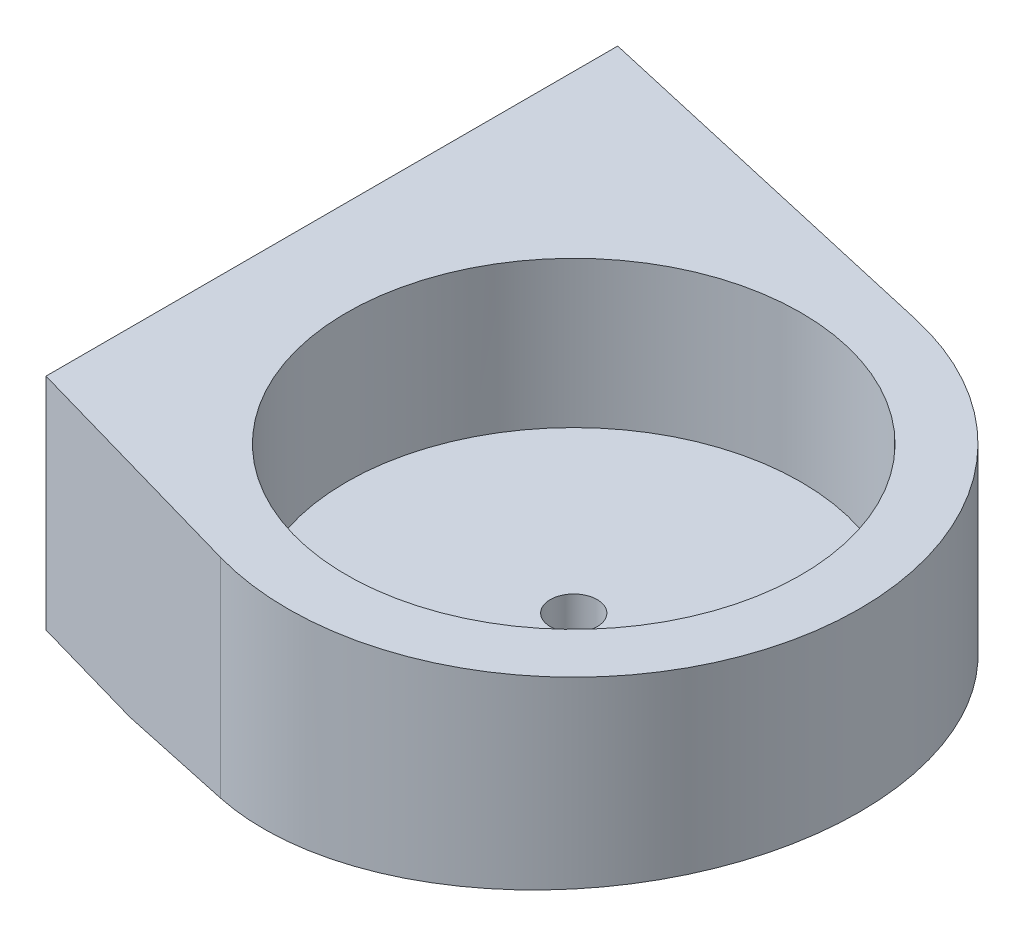
ISO-10303-21;
HEADER;
FILE_DESCRIPTION(('STEP AP214'),'2;1');
FILE_NAME('part.step','',(''),(''),'','','');
FILE_SCHEMA(('AUTOMOTIVE_DESIGN { 1 0 10303 214 1 1 1 1 }'));
ENDSEC;
DATA;
#1=APPLICATION_CONTEXT('core data for automotive mechanical design processes');
#2=APPLICATION_PROTOCOL_DEFINITION('international standard','automotive_design',2000,#1);
#3=PRODUCT_CONTEXT('',#1,'mechanical');
#4=PRODUCT('Part','Part','',(#3));
#5=PRODUCT_RELATED_PRODUCT_CATEGORY('part','',(#4));
#6=PRODUCT_DEFINITION_FORMATION('','',#4);
#7=PRODUCT_DEFINITION_CONTEXT('part definition',#1,'design');
#8=PRODUCT_DEFINITION('design','',#6,#7);
#9=PRODUCT_DEFINITION_SHAPE('','',#8);
#10=(LENGTH_UNIT() NAMED_UNIT(*) SI_UNIT(.MILLI.,.METRE.));
#11=(NAMED_UNIT(*) PLANE_ANGLE_UNIT() SI_UNIT($,.RADIAN.));
#12=(NAMED_UNIT(*) SI_UNIT($,.STERADIAN.) SOLID_ANGLE_UNIT());
#13=UNCERTAINTY_MEASURE_WITH_UNIT(LENGTH_MEASURE(1.E-05),#10,'distance_accuracy_value','');
#14=(GEOMETRIC_REPRESENTATION_CONTEXT(3) GLOBAL_UNCERTAINTY_ASSIGNED_CONTEXT((#13)) GLOBAL_UNIT_ASSIGNED_CONTEXT((#10,
#11,#12)) REPRESENTATION_CONTEXT('',''));
#15=CARTESIAN_POINT('',(0.,0.,0.));
#16=DIRECTION('',(0.,0.,1.));
#17=DIRECTION('',(1.,0.,0.));
#18=AXIS2_PLACEMENT_3D('',#15,#16,#17);
#19=CARTESIAN_POINT('',(4.32348319389158,15.,-19.0146652106246));
#20=DIRECTION('',(0.221717086866235,0.,-0.975111036442287));
#21=DIRECTION('',(-0.975111036442287,0.,-0.221717086866235));
#22=AXIS2_PLACEMENT_3D('',#19,#20,#21);
#23=PLANE('',#22);
#24=DIRECTION('',(0.,-1.,0.));
#25=VECTOR('',#24,1.);
#26=CARTESIAN_POINT('',(4.32348319389158,15.,-19.0146652106246));
#27=LINE('',#26,#25);
#28=CARTESIAN_POINT('',(4.32348319389158,15.,-19.0146652106246));
#29=VERTEX_POINT('',#28);
#30=CARTESIAN_POINT('',(4.32348319389158,1.64090894273656,-19.0146652106246));
#31=VERTEX_POINT('',#30);
#32=EDGE_CURVE('E81',#29,#31,#27,.T.);
#33=ORIENTED_EDGE('',*,*,#32,.T.);
#34=DIRECTION('',(-0.971414372160437,-0.086992331835263,-0.220876553219231));
#35=VECTOR('',#34,1.);
#36=CARTESIAN_POINT('',(5.4524012180103,1.7420060792248,-18.7579760682972));
#37=LINE('',#36,#35);
#38=CARTESIAN_POINT('',(-14.,0.,-23.1809900322722));
#39=VERTEX_POINT('',#38);
#40=EDGE_CURVE('E92',#31,#39,#37,.T.);
#41=ORIENTED_EDGE('',*,*,#40,.T.);
#42=DIRECTION('',(0.975111036442287,0.,0.221717086866235));
#43=VECTOR('',#42,1.);
#44=CARTESIAN_POINT('',(4.32348319389158,0.,-19.0146652106246));
#45=LINE('',#44,#43);
#46=CARTESIAN_POINT('',(-22.,0.,-25.));
#47=VERTEX_POINT('',#46);
#48=EDGE_CURVE('E96',#47,#39,#45,.T.);
#49=ORIENTED_EDGE('',*,*,#48,.F.);
#50=DIRECTION('',(0.,-1.,0.));
#51=VECTOR('',#50,1.);
#52=CARTESIAN_POINT('',(-22.,15.,-25.));
#53=LINE('',#52,#51);
#54=CARTESIAN_POINT('',(-22.,15.,-25.));
#55=VERTEX_POINT('',#54);
#56=EDGE_CURVE('E60',#55,#47,#53,.T.);
#57=ORIENTED_EDGE('',*,*,#56,.F.);
#58=DIRECTION('',(0.975111036442287,0.,0.221717086866235));
#59=VECTOR('',#58,1.);
#60=CARTESIAN_POINT('',(4.32348319389158,15.,-19.0146652106246));
#61=LINE('',#60,#59);
#62=EDGE_CURVE('E130',#55,#29,#61,.T.);
#63=ORIENTED_EDGE('',*,*,#62,.T.);
#64=EDGE_LOOP('',(#33,#41,#49,#57,#63));
#65=FACE_BOUND('',#64,.T.);
#66=ADVANCED_FACE('F37',(#65),#23,.T.);
#67=CARTESIAN_POINT('',(-5.3514292849436,15.,18.7513254093744));
#68=DIRECTION('',(-0.274432271022749,0.,0.961606431249966));
#69=DIRECTION('',(0.961606431249966,0.,0.274432271022749));
#70=AXIS2_PLACEMENT_3D('',#67,#68,#69);
#71=PLANE('',#70);
#72=DIRECTION('',(-0.961606431249966,0.,-0.274432271022749));
#73=VECTOR('',#72,1.);
#74=CARTESIAN_POINT('',(-5.3514292849436,0.,18.7513254093744));
#75=LINE('',#74,#73);
#76=CARTESIAN_POINT('',(-14.,0.,16.2831151049273));
#77=VERTEX_POINT('',#76);
#78=CARTESIAN_POINT('',(-22.,0.,14.));
#79=VERTEX_POINT('',#78);
#80=EDGE_CURVE('E100',#77,#79,#75,.T.);
#81=ORIENTED_EDGE('',*,*,#80,.F.);
#82=DIRECTION('',(0.958060684401584,0.0857964792001418,0.273420352499275));
#83=VECTOR('',#82,1.);
#84=CARTESIAN_POINT('',(-4.18211822024306,0.879213293709578,19.0850343786464));
#85=LINE('',#84,#83);
#86=CARTESIAN_POINT('',(-5.3514292849436,0.774498870005053,18.7513254093744));
#87=VERTEX_POINT('',#86);
#88=EDGE_CURVE('E51',#77,#87,#85,.T.);
#89=ORIENTED_EDGE('',*,*,#88,.T.);
#90=DIRECTION('',(0.,-1.,0.));
#91=VECTOR('',#90,1.);
#92=CARTESIAN_POINT('',(-5.3514292849436,15.,18.7513254093744));
#93=LINE('',#92,#91);
#94=CARTESIAN_POINT('',(-5.3514292849436,15.,18.7513254093744));
#95=VERTEX_POINT('',#94);
#96=EDGE_CURVE('E113',#95,#87,#93,.T.);
#97=ORIENTED_EDGE('',*,*,#96,.F.);
#98=DIRECTION('',(-0.961606431249966,0.,-0.274432271022749));
#99=VECTOR('',#98,1.);
#100=CARTESIAN_POINT('',(-5.3514292849436,15.,18.7513254093744));
#101=LINE('',#100,#99);
#102=CARTESIAN_POINT('',(-22.,15.,14.));
#103=VERTEX_POINT('',#102);
#104=EDGE_CURVE('E136',#95,#103,#101,.T.);
#105=ORIENTED_EDGE('',*,*,#104,.T.);
#106=DIRECTION('',(0.,-1.,0.));
#107=VECTOR('',#106,1.);
#108=CARTESIAN_POINT('',(-22.,15.,14.));
#109=LINE('',#108,#107);
#110=EDGE_CURVE('E110',#103,#79,#109,.T.);
#111=ORIENTED_EDGE('',*,*,#110,.T.);
#112=EDGE_LOOP('',(#81,#89,#97,#105,#111));
#113=FACE_BOUND('',#112,.T.);
#114=ADVANCED_FACE('F144',(#113),#71,.T.);
#115=CARTESIAN_POINT('',(0.,15.,0.));
#116=DIRECTION('',(0.,-1.,0.));
#117=DIRECTION('',(0.,0.,-1.));
#118=AXIS2_PLACEMENT_3D('',#115,#116,#117);
#119=CYLINDRICAL_SURFACE('',#118,19.5);
#120=ORIENTED_EDGE('',*,*,#96,.T.);
#121=CARTESIAN_POINT('',(0.,1.25373134328358,0.));
#122=DIRECTION('',(0.0891952975496599,-0.996014155971203,0.));
#123=DIRECTION('',(-0.996014155971203,-0.0891952975496599,0.));
#124=AXIS2_PLACEMENT_3D('',#121,#122,#123);
#125=ELLIPSE('',#124,19.5780349938759,19.5);
#126=EDGE_CURVE('E143',#87,#31,#125,.F.);
#127=ORIENTED_EDGE('',*,*,#126,.T.);
#128=ORIENTED_EDGE('',*,*,#32,.F.);
#129=CARTESIAN_POINT('',(0.,15.,0.));
#130=DIRECTION('',(0.,-1.,0.));
#131=DIRECTION('',(0.,0.,-1.));
#132=AXIS2_PLACEMENT_3D('',#129,#130,#131);
#133=CIRCLE('',#132,19.5);
#134=EDGE_CURVE('E132',#29,#95,#133,.T.);
#135=ORIENTED_EDGE('',*,*,#134,.T.);
#136=EDGE_LOOP('',(#120,#127,#128,#135));
#137=FACE_BOUND('',#136,.T.);
#138=ADVANCED_FACE('F142',(#137),#119,.T.);
#139=CARTESIAN_POINT('',(0.,0.,0.));
#140=DIRECTION('',(0.,1.,0.));
#141=DIRECTION('',(0.,0.,1.));
#142=AXIS2_PLACEMENT_3D('',#139,#140,#141);
#143=PLANE('',#142);
#144=CARTESIAN_POINT('',(-18.,0.,-5.5));
#145=DIRECTION('',(0.,-1.,0.));
#146=DIRECTION('',(0.,0.,-1.));
#147=AXIS2_PLACEMENT_3D('',#144,#145,#146);
#148=CIRCLE('',#147,2.05);
#149=CARTESIAN_POINT('',(-18.,0.,-7.55));
#150=VERTEX_POINT('',#149);
#151=EDGE_CURVE('E151',#150,#150,#148,.T.);
#152=ORIENTED_EDGE('',*,*,#151,.F.);
#153=EDGE_LOOP('',(#152));
#154=FACE_BOUND('',#153,.T.);
#155=DIRECTION('',(0.,0.,-1.));
#156=VECTOR('',#155,1.);
#157=CARTESIAN_POINT('',(-14.,0.,0.));
#158=LINE('',#157,#156);
#159=EDGE_CURVE('E11',#77,#39,#158,.T.);
#160=ORIENTED_EDGE('',*,*,#159,.F.);
#161=ORIENTED_EDGE('',*,*,#80,.T.);
#162=DIRECTION('',(0.,0.,-1.));
#163=VECTOR('',#162,1.);
#164=CARTESIAN_POINT('',(-22.,0.,0.));
#165=LINE('',#164,#163);
#166=EDGE_CURVE('E99',#79,#47,#165,.T.);
#167=ORIENTED_EDGE('',*,*,#166,.T.);
#168=ORIENTED_EDGE('',*,*,#48,.T.);
#169=EDGE_LOOP('',(#160,#161,#167,#168));
#170=FACE_BOUND('',#169,.T.);
#171=ADVANCED_FACE('F39',(#154,#170),#143,.F.);
#172=CARTESIAN_POINT('',(0.,5.,0.));
#173=DIRECTION('',(0.,1.,0.));
#174=DIRECTION('',(0.,0.,1.));
#175=AXIS2_PLACEMENT_3D('',#172,#173,#174);
#176=PLANE('',#175);
#177=CARTESIAN_POINT('',(0.,5.,0.));
#178=DIRECTION('',(0.,1.,0.));
#179=DIRECTION('',(0.,0.,1.));
#180=AXIS2_PLACEMENT_3D('',#177,#178,#179);
#181=CIRCLE('',#180,1.6);
#182=CARTESIAN_POINT('',(0.,5.,1.6));
#183=VERTEX_POINT('',#182);
#184=EDGE_CURVE('E145',#183,#183,#181,.T.);
#185=ORIENTED_EDGE('',*,*,#184,.F.);
#186=EDGE_LOOP('',(#185));
#187=FACE_BOUND('',#186,.T.);
#188=CARTESIAN_POINT('',(0.,5.,0.));
#189=DIRECTION('',(0.,1.,0.));
#190=DIRECTION('',(0.,0.,1.));
#191=AXIS2_PLACEMENT_3D('',#188,#189,#190);
#192=CIRCLE('',#191,15.5);
#193=CARTESIAN_POINT('',(0.,5.,15.5));
#194=VERTEX_POINT('',#193);
#195=EDGE_CURVE('E45',#194,#194,#192,.T.);
#196=ORIENTED_EDGE('',*,*,#195,.T.);
#197=EDGE_LOOP('',(#196));
#198=FACE_BOUND('',#197,.T.);
#199=ADVANCED_FACE('F119',(#187,#198),#176,.T.);
#200=CARTESIAN_POINT('',(-22.,15.,0.));
#201=DIRECTION('',(-1.,0.,0.));
#202=DIRECTION('',(0.,0.,1.));
#203=AXIS2_PLACEMENT_3D('',#200,#201,#202);
#204=PLANE('',#203);
#205=ORIENTED_EDGE('',*,*,#166,.F.);
#206=ORIENTED_EDGE('',*,*,#110,.F.);
#207=DIRECTION('',(0.,0.,-1.));
#208=VECTOR('',#207,1.);
#209=CARTESIAN_POINT('',(-22.,15.,0.));
#210=LINE('',#209,#208);
#211=EDGE_CURVE('E104',#103,#55,#210,.T.);
#212=ORIENTED_EDGE('',*,*,#211,.T.);
#213=ORIENTED_EDGE('',*,*,#56,.T.);
#214=EDGE_LOOP('',(#205,#206,#212,#213));
#215=FACE_BOUND('',#214,.T.);
#216=ADVANCED_FACE('F125',(#215),#204,.T.);
#217=CARTESIAN_POINT('',(0.,15.,0.));
#218=DIRECTION('',(0.,-1.,0.));
#219=DIRECTION('',(0.,0.,-1.));
#220=AXIS2_PLACEMENT_3D('',#217,#218,#219);
#221=CYLINDRICAL_SURFACE('',#220,15.5);
#222=ORIENTED_EDGE('',*,*,#195,.F.);
#223=EDGE_LOOP('',(#222));
#224=FACE_BOUND('',#223,.T.);
#225=CARTESIAN_POINT('',(0.,15.,0.));
#226=DIRECTION('',(0.,-1.,0.));
#227=DIRECTION('',(0.,0.,-1.));
#228=AXIS2_PLACEMENT_3D('',#225,#226,#227);
#229=CIRCLE('',#228,15.5);
#230=CARTESIAN_POINT('',(0.,15.,-15.5));
#231=VERTEX_POINT('',#230);
#232=EDGE_CURVE('E108',#231,#231,#229,.T.);
#233=ORIENTED_EDGE('',*,*,#232,.F.);
#234=EDGE_LOOP('',(#233));
#235=FACE_BOUND('',#234,.T.);
#236=ADVANCED_FACE('F121',(#224,#235),#221,.F.);
#237=CARTESIAN_POINT('',(0.,15.,0.));
#238=DIRECTION('',(0.,-1.,0.));
#239=DIRECTION('',(0.,0.,-1.));
#240=AXIS2_PLACEMENT_3D('',#237,#238,#239);
#241=PLANE('',#240);
#242=ORIENTED_EDGE('',*,*,#232,.T.);
#243=EDGE_LOOP('',(#242));
#244=FACE_BOUND('',#243,.T.);
#245=ORIENTED_EDGE('',*,*,#62,.F.);
#246=ORIENTED_EDGE('',*,*,#211,.F.);
#247=ORIENTED_EDGE('',*,*,#104,.F.);
#248=ORIENTED_EDGE('',*,*,#134,.F.);
#249=EDGE_LOOP('',(#245,#246,#247,#248));
#250=FACE_BOUND('',#249,.T.);
#251=ADVANCED_FACE('F124',(#244,#250),#241,.F.);
#252=CARTESIAN_POINT('',(-0.111381215469613,1.24375690607735,-24.));
#253=DIRECTION('',(0.0891952975496599,-0.996014155971203,0.));
#254=DIRECTION('',(0.996014155971203,0.0891952975496599,0.));
#255=AXIS2_PLACEMENT_3D('',#252,#253,#254);
#256=PLANE('',#255);
#257=CARTESIAN_POINT('',(0.,1.25373134328358,0.));
#258=DIRECTION('',(0.0891952975496599,-0.996014155971203,0.));
#259=DIRECTION('',(0.996014155971203,0.0891952975496599,0.));
#260=AXIS2_PLACEMENT_3D('',#257,#258,#259);
#261=ELLIPSE('',#260,4.01600717823096,4.);
#262=CARTESIAN_POINT('',(4.,1.61194029850746,0.));
#263=VERTEX_POINT('',#262);
#264=EDGE_CURVE('E157',#263,#263,#261,.F.);
#265=ORIENTED_EDGE('',*,*,#264,.T.);
#266=EDGE_LOOP('',(#265));
#267=FACE_BOUND('',#266,.T.);
#268=ORIENTED_EDGE('',*,*,#126,.F.);
#269=ORIENTED_EDGE('',*,*,#88,.F.);
#270=ORIENTED_EDGE('',*,*,#159,.T.);
#271=ORIENTED_EDGE('',*,*,#40,.F.);
#272=EDGE_LOOP('',(#268,#269,#270,#271));
#273=FACE_BOUND('',#272,.T.);
#274=ADVANCED_FACE('F91',(#267,#273),#256,.T.);
#275=CARTESIAN_POINT('',(0.,0.,0.));
#276=DIRECTION('',(0.,1.,0.));
#277=DIRECTION('',(0.,0.,1.));
#278=AXIS2_PLACEMENT_3D('',#275,#276,#277);
#279=CYLINDRICAL_SURFACE('',#278,1.6);
#280=CARTESIAN_POINT('',(0.,2.,0.));
#281=DIRECTION('',(0.,1.,0.));
#282=DIRECTION('',(0.,0.,1.));
#283=AXIS2_PLACEMENT_3D('',#280,#281,#282);
#284=CIRCLE('',#283,1.6);
#285=CARTESIAN_POINT('',(0.,2.,1.6));
#286=VERTEX_POINT('',#285);
#287=EDGE_CURVE('E154',#286,#286,#284,.T.);
#288=ORIENTED_EDGE('',*,*,#287,.F.);
#289=EDGE_LOOP('',(#288));
#290=FACE_BOUND('',#289,.T.);
#291=ORIENTED_EDGE('',*,*,#184,.T.);
#292=EDGE_LOOP('',(#291));
#293=FACE_BOUND('',#292,.T.);
#294=ADVANCED_FACE('F195',(#290,#293),#279,.F.);
#295=CARTESIAN_POINT('',(-18.,6.,-5.5));
#296=DIRECTION('',(0.,-1.,0.));
#297=DIRECTION('',(0.,0.,-1.));
#298=AXIS2_PLACEMENT_3D('',#295,#296,#297);
#299=CYLINDRICAL_SURFACE('',#298,2.05);
#300=CARTESIAN_POINT('',(-18.,6.,-5.5));
#301=DIRECTION('',(0.,-1.,0.));
#302=DIRECTION('',(0.,0.,-1.));
#303=AXIS2_PLACEMENT_3D('',#300,#301,#302);
#304=CIRCLE('',#303,2.05);
#305=CARTESIAN_POINT('',(-18.,6.,-7.55));
#306=VERTEX_POINT('',#305);
#307=EDGE_CURVE('E150',#306,#306,#304,.T.);
#308=ORIENTED_EDGE('',*,*,#307,.F.);
#309=EDGE_LOOP('',(#308));
#310=FACE_BOUND('',#309,.T.);
#311=ORIENTED_EDGE('',*,*,#151,.T.);
#312=EDGE_LOOP('',(#311));
#313=FACE_BOUND('',#312,.T.);
#314=ADVANCED_FACE('F197',(#310,#313),#299,.F.);
#315=CARTESIAN_POINT('',(-18.,6.,-5.5));
#316=DIRECTION('',(0.,-1.,0.));
#317=DIRECTION('',(0.,0.,-1.));
#318=AXIS2_PLACEMENT_3D('',#315,#316,#317);
#319=PLANE('',#318);
#320=ORIENTED_EDGE('',*,*,#307,.T.);
#321=EDGE_LOOP('',(#320));
#322=FACE_BOUND('',#321,.T.);
#323=ADVANCED_FACE('F175',(#322),#319,.T.);
#324=CARTESIAN_POINT('',(0.,-0.00100000000000013,0.));
#325=DIRECTION('',(0.,1.,0.));
#326=DIRECTION('',(0.,0.,1.));
#327=AXIS2_PLACEMENT_3D('',#324,#325,#326);
#328=CYLINDRICAL_SURFACE('',#327,4.);
#329=ORIENTED_EDGE('',*,*,#264,.F.);
#330=EDGE_LOOP('',(#329));
#331=FACE_BOUND('',#330,.T.);
#332=CARTESIAN_POINT('',(0.,2.,0.));
#333=DIRECTION('',(0.,1.,0.));
#334=DIRECTION('',(0.,0.,1.));
#335=AXIS2_PLACEMENT_3D('',#332,#333,#334);
#336=CIRCLE('',#335,4.);
#337=CARTESIAN_POINT('',(0.,2.,4.));
#338=VERTEX_POINT('',#337);
#339=EDGE_CURVE('E160',#338,#338,#336,.T.);
#340=ORIENTED_EDGE('',*,*,#339,.T.);
#341=EDGE_LOOP('',(#340));
#342=FACE_BOUND('',#341,.T.);
#343=ADVANCED_FACE('F166',(#331,#342),#328,.F.);
#344=CARTESIAN_POINT('',(0.,2.,0.));
#345=DIRECTION('',(0.,1.,0.));
#346=DIRECTION('',(0.,0.,1.));
#347=AXIS2_PLACEMENT_3D('',#344,#345,#346);
#348=PLANE('',#347);
#349=ORIENTED_EDGE('',*,*,#287,.T.);
#350=EDGE_LOOP('',(#349));
#351=FACE_BOUND('',#350,.T.);
#352=ORIENTED_EDGE('',*,*,#339,.F.);
#353=EDGE_LOOP('',(#352));
#354=FACE_BOUND('',#353,.T.);
#355=ADVANCED_FACE('F168',(#351,#354),#348,.F.);
#356=CLOSED_SHELL('',(#66,#114,#138,#171,#199,#216,#236,#251,#274,#294,#314,#323,#343,#355));
#357=MANIFOLD_SOLID_BREP('B2',#356);
#358=ADVANCED_BREP_SHAPE_REPRESENTATION('',(#18,#357),#14);
#359=SHAPE_DEFINITION_REPRESENTATION(#9,#358);
ENDSEC;
END-ISO-10303-21;
